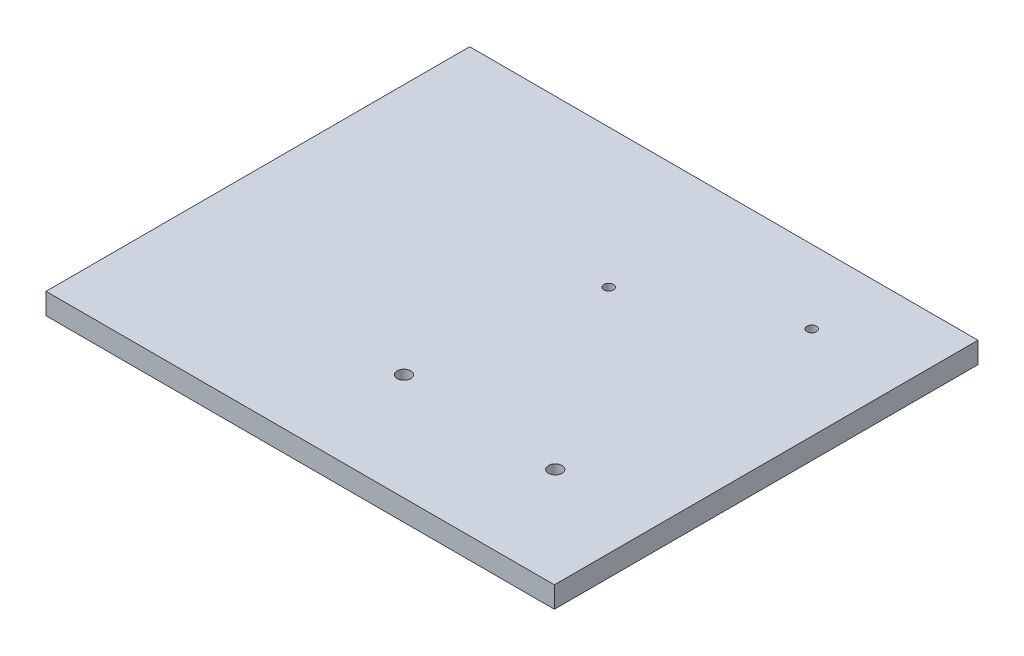
ISO-10303-21;
HEADER;
FILE_DESCRIPTION(('STEP AP214'),'2;1');
FILE_NAME('part.step','',(''),(''),'','','');
FILE_SCHEMA(('AUTOMOTIVE_DESIGN { 1 0 10303 214 1 1 1 1 }'));
ENDSEC;
DATA;
#1=APPLICATION_CONTEXT('core data for automotive mechanical design processes');
#2=APPLICATION_PROTOCOL_DEFINITION('international standard','automotive_design',2000,#1);
#3=PRODUCT_CONTEXT('',#1,'mechanical');
#4=PRODUCT('Part','Part','',(#3));
#5=PRODUCT_RELATED_PRODUCT_CATEGORY('part','',(#4));
#6=PRODUCT_DEFINITION_FORMATION('','',#4);
#7=PRODUCT_DEFINITION_CONTEXT('part definition',#1,'design');
#8=PRODUCT_DEFINITION('design','',#6,#7);
#9=PRODUCT_DEFINITION_SHAPE('','',#8);
#10=(LENGTH_UNIT() NAMED_UNIT(*) SI_UNIT(.MILLI.,.METRE.));
#11=(NAMED_UNIT(*) PLANE_ANGLE_UNIT() SI_UNIT($,.RADIAN.));
#12=(NAMED_UNIT(*) SI_UNIT($,.STERADIAN.) SOLID_ANGLE_UNIT());
#13=UNCERTAINTY_MEASURE_WITH_UNIT(LENGTH_MEASURE(1.E-05),#10,'distance_accuracy_value','');
#14=(GEOMETRIC_REPRESENTATION_CONTEXT(3) GLOBAL_UNCERTAINTY_ASSIGNED_CONTEXT((#13)) GLOBAL_UNIT_ASSIGNED_CONTEXT((#10,
#11,#12)) REPRESENTATION_CONTEXT('',''));
#15=CARTESIAN_POINT('',(0.,0.,0.));
#16=DIRECTION('',(0.,0.,1.));
#17=DIRECTION('',(1.,0.,0.));
#18=AXIS2_PLACEMENT_3D('',#15,#16,#17);
#19=CARTESIAN_POINT('',(0.,5.,0.));
#20=DIRECTION('',(0.,1.,0.));
#21=DIRECTION('',(0.,0.,1.));
#22=AXIS2_PLACEMENT_3D('',#19,#20,#21);
#23=PLANE('',#22);
#24=CARTESIAN_POINT('',(38.07,5.,-32.68));
#25=DIRECTION('',(0.,1.,0.));
#26=DIRECTION('',(0.,0.,1.));
#27=AXIS2_PLACEMENT_3D('',#24,#25,#26);
#28=CIRCLE('',#27,1.13);
#29=CARTESIAN_POINT('',(38.07,5.,-31.55));
#30=VERTEX_POINT('',#29);
#31=EDGE_CURVE('E121',#30,#30,#28,.T.);
#32=ORIENTED_EDGE('',*,*,#31,.F.);
#33=EDGE_LOOP('',(#32));
#34=FACE_BOUND('',#33,.T.);
#35=CARTESIAN_POINT('',(36.5,5.,26.3));
#36=DIRECTION('',(0.,1.,0.));
#37=DIRECTION('',(0.,0.,1.));
#38=AXIS2_PLACEMENT_3D('',#35,#36,#37);
#39=CIRCLE('',#38,1.6);
#40=CARTESIAN_POINT('',(36.5,5.,27.9));
#41=VERTEX_POINT('',#40);
#42=EDGE_CURVE('E100',#41,#41,#39,.T.);
#43=ORIENTED_EDGE('',*,*,#42,.F.);
#44=EDGE_LOOP('',(#43));
#45=FACE_BOUND('',#44,.T.);
#46=DIRECTION('',(0.,0.,1.));
#47=VECTOR('',#46,1.);
#48=CARTESIAN_POINT('',(-60.,5.,-50.));
#49=LINE('',#48,#47);
#50=CARTESIAN_POINT('',(-60.,5.,-50.));
#51=VERTEX_POINT('',#50);
#52=CARTESIAN_POINT('',(-60.,5.,50.));
#53=VERTEX_POINT('',#52);
#54=EDGE_CURVE('E85',#51,#53,#49,.T.);
#55=ORIENTED_EDGE('',*,*,#54,.T.);
#56=DIRECTION('',(1.,0.,0.));
#57=VECTOR('',#56,1.);
#58=CARTESIAN_POINT('',(-60.,5.,50.));
#59=LINE('',#58,#57);
#60=CARTESIAN_POINT('',(60.,5.,50.));
#61=VERTEX_POINT('',#60);
#62=EDGE_CURVE('E80',#53,#61,#59,.T.);
#63=ORIENTED_EDGE('',*,*,#62,.T.);
#64=DIRECTION('',(0.,0.,-1.));
#65=VECTOR('',#64,1.);
#66=CARTESIAN_POINT('',(60.,5.,-50.));
#67=LINE('',#66,#65);
#68=CARTESIAN_POINT('',(60.,5.,-50.));
#69=VERTEX_POINT('',#68);
#70=EDGE_CURVE('E83',#61,#69,#67,.T.);
#71=ORIENTED_EDGE('',*,*,#70,.T.);
#72=DIRECTION('',(-1.,0.,0.));
#73=VECTOR('',#72,1.);
#74=CARTESIAN_POINT('',(-60.,5.,-50.));
#75=LINE('',#74,#73);
#76=EDGE_CURVE('E50',#69,#51,#75,.T.);
#77=ORIENTED_EDGE('',*,*,#76,.T.);
#78=EDGE_LOOP('',(#55,#63,#71,#77));
#79=FACE_BOUND('',#78,.T.);
#80=CARTESIAN_POINT('',(-0.699999999999999,5.,24.8));
#81=DIRECTION('',(0.,1.,0.));
#82=DIRECTION('',(0.,0.,1.));
#83=AXIS2_PLACEMENT_3D('',#80,#81,#82);
#84=CIRCLE('',#83,1.6);
#85=CARTESIAN_POINT('',(-0.699999999999999,5.,26.4));
#86=VERTEX_POINT('',#85);
#87=EDGE_CURVE('E115',#86,#86,#84,.T.);
#88=ORIENTED_EDGE('',*,*,#87,.F.);
#89=EDGE_LOOP('',(#88));
#90=FACE_BOUND('',#89,.T.);
#91=CARTESIAN_POINT('',(5.56,5.,-17.26));
#92=DIRECTION('',(0.,1.,0.));
#93=DIRECTION('',(0.,0.,1.));
#94=AXIS2_PLACEMENT_3D('',#91,#92,#93);
#95=CIRCLE('',#94,1.13);
#96=CARTESIAN_POINT('',(5.56,5.,-16.13));
#97=VERTEX_POINT('',#96);
#98=EDGE_CURVE('E127',#97,#97,#95,.T.);
#99=ORIENTED_EDGE('',*,*,#98,.F.);
#100=EDGE_LOOP('',(#99));
#101=FACE_BOUND('',#100,.T.);
#102=ADVANCED_FACE('F33',(#34,#45,#79,#90,#101),#23,.T.);
#103=CARTESIAN_POINT('',(0.,0.,0.));
#104=DIRECTION('',(0.,1.,0.));
#105=DIRECTION('',(0.,0.,1.));
#106=AXIS2_PLACEMENT_3D('',#103,#104,#105);
#107=PLANE('',#106);
#108=DIRECTION('',(0.,0.,1.));
#109=VECTOR('',#108,1.);
#110=CARTESIAN_POINT('',(-60.,0.,-50.));
#111=LINE('',#110,#109);
#112=CARTESIAN_POINT('',(-60.,0.,-50.));
#113=VERTEX_POINT('',#112);
#114=CARTESIAN_POINT('',(-60.,0.,50.));
#115=VERTEX_POINT('',#114);
#116=EDGE_CURVE('E97',#113,#115,#111,.T.);
#117=ORIENTED_EDGE('',*,*,#116,.F.);
#118=DIRECTION('',(-1.,0.,0.));
#119=VECTOR('',#118,1.);
#120=CARTESIAN_POINT('',(-60.,0.,-50.));
#121=LINE('',#120,#119);
#122=CARTESIAN_POINT('',(60.,0.,-50.));
#123=VERTEX_POINT('',#122);
#124=EDGE_CURVE('E73',#123,#113,#121,.T.);
#125=ORIENTED_EDGE('',*,*,#124,.F.);
#126=DIRECTION('',(0.,0.,-1.));
#127=VECTOR('',#126,1.);
#128=CARTESIAN_POINT('',(60.,0.,-50.));
#129=LINE('',#128,#127);
#130=CARTESIAN_POINT('',(60.,0.,50.));
#131=VERTEX_POINT('',#130);
#132=EDGE_CURVE('E67',#131,#123,#129,.T.);
#133=ORIENTED_EDGE('',*,*,#132,.F.);
#134=DIRECTION('',(1.,0.,0.));
#135=VECTOR('',#134,1.);
#136=CARTESIAN_POINT('',(-60.,0.,50.));
#137=LINE('',#136,#135);
#138=EDGE_CURVE('E89',#115,#131,#137,.T.);
#139=ORIENTED_EDGE('',*,*,#138,.F.);
#140=EDGE_LOOP('',(#117,#125,#133,#139));
#141=FACE_BOUND('',#140,.T.);
#142=CARTESIAN_POINT('',(36.5,0.,26.3));
#143=DIRECTION('',(0.,1.,0.));
#144=DIRECTION('',(0.,0.,1.));
#145=AXIS2_PLACEMENT_3D('',#142,#143,#144);
#146=CIRCLE('',#145,1.6);
#147=CARTESIAN_POINT('',(36.5,0.,27.9));
#148=VERTEX_POINT('',#147);
#149=EDGE_CURVE('E112',#148,#148,#146,.T.);
#150=ORIENTED_EDGE('',*,*,#149,.T.);
#151=EDGE_LOOP('',(#150));
#152=FACE_BOUND('',#151,.T.);
#153=CARTESIAN_POINT('',(-0.699999999999999,0.,24.8));
#154=DIRECTION('',(0.,1.,0.));
#155=DIRECTION('',(0.,0.,1.));
#156=AXIS2_PLACEMENT_3D('',#153,#154,#155);
#157=CIRCLE('',#156,1.6);
#158=CARTESIAN_POINT('',(-0.699999999999999,0.,26.4));
#159=VERTEX_POINT('',#158);
#160=EDGE_CURVE('E118',#159,#159,#157,.T.);
#161=ORIENTED_EDGE('',*,*,#160,.T.);
#162=EDGE_LOOP('',(#161));
#163=FACE_BOUND('',#162,.T.);
#164=CARTESIAN_POINT('',(38.07,0.,-32.68));
#165=DIRECTION('',(0.,1.,0.));
#166=DIRECTION('',(0.,0.,1.));
#167=AXIS2_PLACEMENT_3D('',#164,#165,#166);
#168=CIRCLE('',#167,1.13);
#169=CARTESIAN_POINT('',(38.07,0.,-31.55));
#170=VERTEX_POINT('',#169);
#171=EDGE_CURVE('E124',#170,#170,#168,.T.);
#172=ORIENTED_EDGE('',*,*,#171,.T.);
#173=EDGE_LOOP('',(#172));
#174=FACE_BOUND('',#173,.T.);
#175=CARTESIAN_POINT('',(5.56,0.,-17.26));
#176=DIRECTION('',(0.,1.,0.));
#177=DIRECTION('',(0.,0.,1.));
#178=AXIS2_PLACEMENT_3D('',#175,#176,#177);
#179=CIRCLE('',#178,1.13);
#180=CARTESIAN_POINT('',(5.56,0.,-16.13));
#181=VERTEX_POINT('',#180);
#182=EDGE_CURVE('E130',#181,#181,#179,.T.);
#183=ORIENTED_EDGE('',*,*,#182,.T.);
#184=EDGE_LOOP('',(#183));
#185=FACE_BOUND('',#184,.T.);
#186=ADVANCED_FACE('F108',(#141,#152,#163,#174,#185),#107,.F.);
#187=CARTESIAN_POINT('',(-60.,5.,-50.));
#188=DIRECTION('',(1.,0.,0.));
#189=DIRECTION('',(0.,0.,-1.));
#190=AXIS2_PLACEMENT_3D('',#187,#188,#189);
#191=PLANE('',#190);
#192=ORIENTED_EDGE('',*,*,#116,.T.);
#193=DIRECTION('',(0.,-1.,0.));
#194=VECTOR('',#193,1.);
#195=CARTESIAN_POINT('',(-60.,5.,50.));
#196=LINE('',#195,#194);
#197=EDGE_CURVE('E11',#53,#115,#196,.T.);
#198=ORIENTED_EDGE('',*,*,#197,.F.);
#199=ORIENTED_EDGE('',*,*,#54,.F.);
#200=DIRECTION('',(0.,-1.,0.));
#201=VECTOR('',#200,1.);
#202=CARTESIAN_POINT('',(-60.,5.,-50.));
#203=LINE('',#202,#201);
#204=EDGE_CURVE('E93',#51,#113,#203,.T.);
#205=ORIENTED_EDGE('',*,*,#204,.T.);
#206=EDGE_LOOP('',(#192,#198,#199,#205));
#207=FACE_BOUND('',#206,.T.);
#208=ADVANCED_FACE('F35',(#207),#191,.F.);
#209=CARTESIAN_POINT('',(-60.,5.,50.));
#210=DIRECTION('',(0.,0.,-1.));
#211=DIRECTION('',(-1.,0.,0.));
#212=AXIS2_PLACEMENT_3D('',#209,#210,#211);
#213=PLANE('',#212);
#214=ORIENTED_EDGE('',*,*,#138,.T.);
#215=DIRECTION('',(0.,-1.,0.));
#216=VECTOR('',#215,1.);
#217=CARTESIAN_POINT('',(60.,5.,50.));
#218=LINE('',#217,#216);
#219=EDGE_CURVE('E42',#61,#131,#218,.T.);
#220=ORIENTED_EDGE('',*,*,#219,.F.);
#221=ORIENTED_EDGE('',*,*,#62,.F.);
#222=ORIENTED_EDGE('',*,*,#197,.T.);
#223=EDGE_LOOP('',(#214,#220,#221,#222));
#224=FACE_BOUND('',#223,.T.);
#225=ADVANCED_FACE('F88',(#224),#213,.F.);
#226=CARTESIAN_POINT('',(60.,5.,-50.));
#227=DIRECTION('',(-1.,0.,0.));
#228=DIRECTION('',(0.,0.,1.));
#229=AXIS2_PLACEMENT_3D('',#226,#227,#228);
#230=PLANE('',#229);
#231=ORIENTED_EDGE('',*,*,#132,.T.);
#232=DIRECTION('',(0.,-1.,0.));
#233=VECTOR('',#232,1.);
#234=CARTESIAN_POINT('',(60.,5.,-50.));
#235=LINE('',#234,#233);
#236=EDGE_CURVE('E90',#69,#123,#235,.T.);
#237=ORIENTED_EDGE('',*,*,#236,.F.);
#238=ORIENTED_EDGE('',*,*,#70,.F.);
#239=ORIENTED_EDGE('',*,*,#219,.T.);
#240=EDGE_LOOP('',(#231,#237,#238,#239));
#241=FACE_BOUND('',#240,.T.);
#242=ADVANCED_FACE('F91',(#241),#230,.F.);
#243=CARTESIAN_POINT('',(-60.,5.,-50.));
#244=DIRECTION('',(0.,0.,1.));
#245=DIRECTION('',(1.,0.,0.));
#246=AXIS2_PLACEMENT_3D('',#243,#244,#245);
#247=PLANE('',#246);
#248=ORIENTED_EDGE('',*,*,#124,.T.);
#249=ORIENTED_EDGE('',*,*,#204,.F.);
#250=ORIENTED_EDGE('',*,*,#76,.F.);
#251=ORIENTED_EDGE('',*,*,#236,.T.);
#252=EDGE_LOOP('',(#248,#249,#250,#251));
#253=FACE_BOUND('',#252,.T.);
#254=ADVANCED_FACE('F105',(#253),#247,.F.);
#255=CARTESIAN_POINT('',(36.5,5.,26.3));
#256=DIRECTION('',(0.,-1.,0.));
#257=DIRECTION('',(0.,0.,-1.));
#258=AXIS2_PLACEMENT_3D('',#255,#256,#257);
#259=CYLINDRICAL_SURFACE('',#258,1.6);
#260=ORIENTED_EDGE('',*,*,#42,.T.);
#261=EDGE_LOOP('',(#260));
#262=FACE_BOUND('',#261,.T.);
#263=ORIENTED_EDGE('',*,*,#149,.F.);
#264=EDGE_LOOP('',(#263));
#265=FACE_BOUND('',#264,.T.);
#266=ADVANCED_FACE('F149',(#262,#265),#259,.F.);
#267=CARTESIAN_POINT('',(-0.699999999999999,5.,24.8));
#268=DIRECTION('',(0.,-1.,0.));
#269=DIRECTION('',(0.,0.,-1.));
#270=AXIS2_PLACEMENT_3D('',#267,#268,#269);
#271=CYLINDRICAL_SURFACE('',#270,1.6);
#272=ORIENTED_EDGE('',*,*,#87,.T.);
#273=EDGE_LOOP('',(#272));
#274=FACE_BOUND('',#273,.T.);
#275=ORIENTED_EDGE('',*,*,#160,.F.);
#276=EDGE_LOOP('',(#275));
#277=FACE_BOUND('',#276,.T.);
#278=ADVANCED_FACE('F195',(#274,#277),#271,.F.);
#279=CARTESIAN_POINT('',(38.07,5.,-32.68));
#280=DIRECTION('',(0.,-1.,0.));
#281=DIRECTION('',(0.,0.,-1.));
#282=AXIS2_PLACEMENT_3D('',#279,#280,#281);
#283=CYLINDRICAL_SURFACE('',#282,1.13);
#284=ORIENTED_EDGE('',*,*,#31,.T.);
#285=EDGE_LOOP('',(#284));
#286=FACE_BOUND('',#285,.T.);
#287=ORIENTED_EDGE('',*,*,#171,.F.);
#288=EDGE_LOOP('',(#287));
#289=FACE_BOUND('',#288,.T.);
#290=ADVANCED_FACE('F203',(#286,#289),#283,.F.);
#291=CARTESIAN_POINT('',(5.56,5.,-17.26));
#292=DIRECTION('',(0.,-1.,0.));
#293=DIRECTION('',(0.,0.,-1.));
#294=AXIS2_PLACEMENT_3D('',#291,#292,#293);
#295=CYLINDRICAL_SURFACE('',#294,1.13);
#296=ORIENTED_EDGE('',*,*,#98,.T.);
#297=EDGE_LOOP('',(#296));
#298=FACE_BOUND('',#297,.T.);
#299=ORIENTED_EDGE('',*,*,#182,.F.);
#300=EDGE_LOOP('',(#299));
#301=FACE_BOUND('',#300,.T.);
#302=ADVANCED_FACE('F136',(#298,#301),#295,.F.);
#303=CLOSED_SHELL('',(#102,#186,#208,#225,#242,#254,#266,#278,#290,#302));
#304=MANIFOLD_SOLID_BREP('B2',#303);
#305=ADVANCED_BREP_SHAPE_REPRESENTATION('',(#18,#304),#14);
#306=SHAPE_DEFINITION_REPRESENTATION(#9,#305);
ENDSEC;
END-ISO-10303-21;
